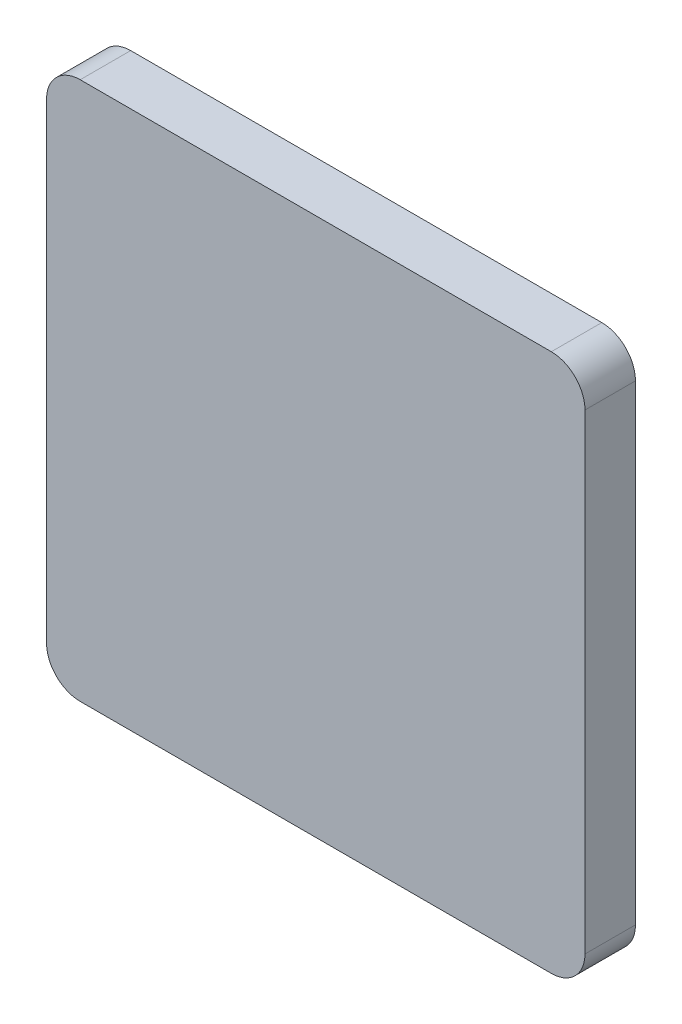
ISO-10303-21;
HEADER;
FILE_DESCRIPTION(('STEP AP214'),'2;1');
FILE_NAME('part.step','',(''),(''),'','','');
FILE_SCHEMA(('AUTOMOTIVE_DESIGN { 1 0 10303 214 1 1 1 1 }'));
ENDSEC;
DATA;
#1=APPLICATION_CONTEXT('core data for automotive mechanical design processes');
#2=APPLICATION_PROTOCOL_DEFINITION('international standard','automotive_design',2000,#1);
#3=PRODUCT_CONTEXT('',#1,'mechanical');
#4=PRODUCT('Part','Part','',(#3));
#5=PRODUCT_RELATED_PRODUCT_CATEGORY('part','',(#4));
#6=PRODUCT_DEFINITION_FORMATION('','',#4);
#7=PRODUCT_DEFINITION_CONTEXT('part definition',#1,'design');
#8=PRODUCT_DEFINITION('design','',#6,#7);
#9=PRODUCT_DEFINITION_SHAPE('','',#8);
#10=(LENGTH_UNIT() NAMED_UNIT(*) SI_UNIT(.MILLI.,.METRE.));
#11=(NAMED_UNIT(*) PLANE_ANGLE_UNIT() SI_UNIT($,.RADIAN.));
#12=(NAMED_UNIT(*) SI_UNIT($,.STERADIAN.) SOLID_ANGLE_UNIT());
#13=UNCERTAINTY_MEASURE_WITH_UNIT(LENGTH_MEASURE(1.E-05),#10,'distance_accuracy_value','');
#14=(GEOMETRIC_REPRESENTATION_CONTEXT(3) GLOBAL_UNCERTAINTY_ASSIGNED_CONTEXT((#13)) GLOBAL_UNIT_ASSIGNED_CONTEXT((#10,
#11,#12)) REPRESENTATION_CONTEXT('',''));
#15=CARTESIAN_POINT('',(0.,0.,0.));
#16=DIRECTION('',(0.,0.,1.));
#17=DIRECTION('',(1.,0.,0.));
#18=AXIS2_PLACEMENT_3D('',#15,#16,#17);
#19=CARTESIAN_POINT('',(16.,16.,3.));
#20=DIRECTION('',(-1.,0.,0.));
#21=DIRECTION('',(0.,0.,1.));
#22=AXIS2_PLACEMENT_3D('',#19,#20,#21);
#23=PLANE('',#22);
#24=DIRECTION('',(0.,1.,0.));
#25=VECTOR('',#24,1.);
#26=CARTESIAN_POINT('',(16.,16.,3.));
#27=LINE('',#26,#25);
#28=CARTESIAN_POINT('',(16.,-14.,3.));
#29=VERTEX_POINT('',#28);
#30=CARTESIAN_POINT('',(16.,14.,3.));
#31=VERTEX_POINT('',#30);
#32=EDGE_CURVE('E127',#29,#31,#27,.T.);
#33=ORIENTED_EDGE('',*,*,#32,.F.);
#34=DIRECTION('',(0.,0.,-1.));
#35=VECTOR('',#34,1.);
#36=CARTESIAN_POINT('',(16.,-14.,3.));
#37=LINE('',#36,#35);
#38=CARTESIAN_POINT('',(16.,-14.,0.));
#39=VERTEX_POINT('',#38);
#40=EDGE_CURVE('E112',#29,#39,#37,.T.);
#41=ORIENTED_EDGE('',*,*,#40,.T.);
#42=DIRECTION('',(0.,1.,0.));
#43=VECTOR('',#42,1.);
#44=CARTESIAN_POINT('',(16.,16.,0.));
#45=LINE('',#44,#43);
#46=CARTESIAN_POINT('',(16.,14.,0.));
#47=VERTEX_POINT('',#46);
#48=EDGE_CURVE('E124',#39,#47,#45,.T.);
#49=ORIENTED_EDGE('',*,*,#48,.T.);
#50=DIRECTION('',(0.,0.,-1.));
#51=VECTOR('',#50,1.);
#52=CARTESIAN_POINT('',(16.,14.,3.));
#53=LINE('',#52,#51);
#54=EDGE_CURVE('E129',#47,#31,#53,.F.);
#55=ORIENTED_EDGE('',*,*,#54,.T.);
#56=EDGE_LOOP('',(#33,#41,#49,#55));
#57=FACE_BOUND('',#56,.T.);
#58=ADVANCED_FACE('F41',(#57),#23,.F.);
#59=CARTESIAN_POINT('',(-16.,16.,3.));
#60=DIRECTION('',(0.,-1.,0.));
#61=DIRECTION('',(0.,0.,-1.));
#62=AXIS2_PLACEMENT_3D('',#59,#60,#61);
#63=PLANE('',#62);
#64=DIRECTION('',(-1.,0.,0.));
#65=VECTOR('',#64,1.);
#66=CARTESIAN_POINT('',(-16.,16.,3.));
#67=LINE('',#66,#65);
#68=CARTESIAN_POINT('',(14.,16.,3.));
#69=VERTEX_POINT('',#68);
#70=CARTESIAN_POINT('',(-14.,16.,3.));
#71=VERTEX_POINT('',#70);
#72=EDGE_CURVE('E167',#69,#71,#67,.T.);
#73=ORIENTED_EDGE('',*,*,#72,.F.);
#74=DIRECTION('',(0.,0.,-1.));
#75=VECTOR('',#74,1.);
#76=CARTESIAN_POINT('',(14.,16.,3.));
#77=LINE('',#76,#75);
#78=CARTESIAN_POINT('',(14.,16.,0.));
#79=VERTEX_POINT('',#78);
#80=EDGE_CURVE('E11',#69,#79,#77,.T.);
#81=ORIENTED_EDGE('',*,*,#80,.T.);
#82=DIRECTION('',(-1.,0.,0.));
#83=VECTOR('',#82,1.);
#84=CARTESIAN_POINT('',(-16.,16.,0.));
#85=LINE('',#84,#83);
#86=CARTESIAN_POINT('',(-14.,16.,0.));
#87=VERTEX_POINT('',#86);
#88=EDGE_CURVE('E134',#79,#87,#85,.T.);
#89=ORIENTED_EDGE('',*,*,#88,.T.);
#90=DIRECTION('',(0.,0.,-1.));
#91=VECTOR('',#90,1.);
#92=CARTESIAN_POINT('',(-14.,16.,3.));
#93=LINE('',#92,#91);
#94=EDGE_CURVE('E49',#87,#71,#93,.F.);
#95=ORIENTED_EDGE('',*,*,#94,.T.);
#96=EDGE_LOOP('',(#73,#81,#89,#95));
#97=FACE_BOUND('',#96,.T.);
#98=ADVANCED_FACE('F166',(#97),#63,.F.);
#99=CARTESIAN_POINT('',(-16.,16.,3.));
#100=DIRECTION('',(1.,0.,0.));
#101=DIRECTION('',(0.,0.,-1.));
#102=AXIS2_PLACEMENT_3D('',#99,#100,#101);
#103=PLANE('',#102);
#104=DIRECTION('',(0.,-1.,0.));
#105=VECTOR('',#104,1.);
#106=CARTESIAN_POINT('',(-16.,16.,0.));
#107=LINE('',#106,#105);
#108=CARTESIAN_POINT('',(-16.,14.,0.));
#109=VERTEX_POINT('',#108);
#110=CARTESIAN_POINT('',(-16.,-14.,0.));
#111=VERTEX_POINT('',#110);
#112=EDGE_CURVE('E137',#109,#111,#107,.T.);
#113=ORIENTED_EDGE('',*,*,#112,.T.);
#114=DIRECTION('',(0.,0.,-1.));
#115=VECTOR('',#114,1.);
#116=CARTESIAN_POINT('',(-16.,-14.,3.));
#117=LINE('',#116,#115);
#118=CARTESIAN_POINT('',(-16.,-14.,3.));
#119=VERTEX_POINT('',#118);
#120=EDGE_CURVE('E56',#111,#119,#117,.F.);
#121=ORIENTED_EDGE('',*,*,#120,.T.);
#122=DIRECTION('',(0.,-1.,0.));
#123=VECTOR('',#122,1.);
#124=CARTESIAN_POINT('',(-16.,16.,3.));
#125=LINE('',#124,#123);
#126=CARTESIAN_POINT('',(-16.,14.,3.));
#127=VERTEX_POINT('',#126);
#128=EDGE_CURVE('E173',#127,#119,#125,.T.);
#129=ORIENTED_EDGE('',*,*,#128,.F.);
#130=DIRECTION('',(0.,0.,-1.));
#131=VECTOR('',#130,1.);
#132=CARTESIAN_POINT('',(-16.,14.,3.));
#133=LINE('',#132,#131);
#134=EDGE_CURVE('E160',#127,#109,#133,.T.);
#135=ORIENTED_EDGE('',*,*,#134,.T.);
#136=EDGE_LOOP('',(#113,#121,#129,#135));
#137=FACE_BOUND('',#136,.T.);
#138=ADVANCED_FACE('F177',(#137),#103,.F.);
#139=CARTESIAN_POINT('',(-16.,-16.,3.));
#140=DIRECTION('',(0.,1.,0.));
#141=DIRECTION('',(0.,0.,1.));
#142=AXIS2_PLACEMENT_3D('',#139,#140,#141);
#143=PLANE('',#142);
#144=DIRECTION('',(1.,0.,0.));
#145=VECTOR('',#144,1.);
#146=CARTESIAN_POINT('',(-16.,-16.,0.));
#147=LINE('',#146,#145);
#148=CARTESIAN_POINT('',(-14.,-16.,0.));
#149=VERTEX_POINT('',#148);
#150=CARTESIAN_POINT('',(14.,-16.,0.));
#151=VERTEX_POINT('',#150);
#152=EDGE_CURVE('E144',#149,#151,#147,.T.);
#153=ORIENTED_EDGE('',*,*,#152,.T.);
#154=DIRECTION('',(0.,0.,-1.));
#155=VECTOR('',#154,1.);
#156=CARTESIAN_POINT('',(14.,-16.,3.));
#157=LINE('',#156,#155);
#158=CARTESIAN_POINT('',(14.,-16.,3.));
#159=VERTEX_POINT('',#158);
#160=EDGE_CURVE('E113',#151,#159,#157,.F.);
#161=ORIENTED_EDGE('',*,*,#160,.T.);
#162=DIRECTION('',(1.,0.,0.));
#163=VECTOR('',#162,1.);
#164=CARTESIAN_POINT('',(-16.,-16.,3.));
#165=LINE('',#164,#163);
#166=CARTESIAN_POINT('',(-14.,-16.,3.));
#167=VERTEX_POINT('',#166);
#168=EDGE_CURVE('E140',#167,#159,#165,.T.);
#169=ORIENTED_EDGE('',*,*,#168,.F.);
#170=DIRECTION('',(0.,0.,-1.));
#171=VECTOR('',#170,1.);
#172=CARTESIAN_POINT('',(-14.,-16.,3.));
#173=LINE('',#172,#171);
#174=EDGE_CURVE('E118',#167,#149,#173,.T.);
#175=ORIENTED_EDGE('',*,*,#174,.T.);
#176=EDGE_LOOP('',(#153,#161,#169,#175));
#177=FACE_BOUND('',#176,.T.);
#178=ADVANCED_FACE('F184',(#177),#143,.F.);
#179=CARTESIAN_POINT('',(0.,0.,3.));
#180=DIRECTION('',(0.,0.,1.));
#181=DIRECTION('',(1.,0.,0.));
#182=AXIS2_PLACEMENT_3D('',#179,#180,#181);
#183=PLANE('',#182);
#184=ORIENTED_EDGE('',*,*,#168,.T.);
#185=CARTESIAN_POINT('',(14.,-14.,3.));
#186=DIRECTION('',(0.,0.,1.));
#187=DIRECTION('',(1.,0.,0.));
#188=AXIS2_PLACEMENT_3D('',#185,#186,#187);
#189=CIRCLE('',#188,2.);
#190=EDGE_CURVE('E158',#159,#29,#189,.T.);
#191=ORIENTED_EDGE('',*,*,#190,.T.);
#192=ORIENTED_EDGE('',*,*,#32,.T.);
#193=CARTESIAN_POINT('',(14.,14.,3.));
#194=DIRECTION('',(0.,0.,1.));
#195=DIRECTION('',(1.,0.,0.));
#196=AXIS2_PLACEMENT_3D('',#193,#194,#195);
#197=CIRCLE('',#196,2.);
#198=EDGE_CURVE('E154',#31,#69,#197,.T.);
#199=ORIENTED_EDGE('',*,*,#198,.T.);
#200=ORIENTED_EDGE('',*,*,#72,.T.);
#201=CARTESIAN_POINT('',(-14.,14.,3.));
#202=DIRECTION('',(0.,0.,1.));
#203=DIRECTION('',(1.,0.,0.));
#204=AXIS2_PLACEMENT_3D('',#201,#202,#203);
#205=CIRCLE('',#204,2.);
#206=EDGE_CURVE('E63',#71,#127,#205,.T.);
#207=ORIENTED_EDGE('',*,*,#206,.T.);
#208=ORIENTED_EDGE('',*,*,#128,.T.);
#209=CARTESIAN_POINT('',(-14.,-14.,3.));
#210=DIRECTION('',(0.,0.,1.));
#211=DIRECTION('',(1.,0.,0.));
#212=AXIS2_PLACEMENT_3D('',#209,#210,#211);
#213=CIRCLE('',#212,2.);
#214=EDGE_CURVE('E156',#119,#167,#213,.T.);
#215=ORIENTED_EDGE('',*,*,#214,.T.);
#216=EDGE_LOOP('',(#184,#191,#192,#199,#200,#207,#208,#215));
#217=FACE_BOUND('',#216,.T.);
#218=ADVANCED_FACE('F171',(#217),#183,.T.);
#219=CARTESIAN_POINT('',(0.,0.,0.));
#220=DIRECTION('',(0.,0.,1.));
#221=DIRECTION('',(1.,0.,0.));
#222=AXIS2_PLACEMENT_3D('',#219,#220,#221);
#223=PLANE('',#222);
#224=ORIENTED_EDGE('',*,*,#48,.F.);
#225=CARTESIAN_POINT('',(14.,-14.,0.));
#226=DIRECTION('',(0.,0.,1.));
#227=DIRECTION('',(1.,0.,0.));
#228=AXIS2_PLACEMENT_3D('',#225,#226,#227);
#229=CIRCLE('',#228,2.);
#230=EDGE_CURVE('E108',#39,#151,#229,.F.);
#231=ORIENTED_EDGE('',*,*,#230,.T.);
#232=ORIENTED_EDGE('',*,*,#152,.F.);
#233=CARTESIAN_POINT('',(-14.,-14.,0.));
#234=DIRECTION('',(0.,0.,1.));
#235=DIRECTION('',(1.,0.,0.));
#236=AXIS2_PLACEMENT_3D('',#233,#234,#235);
#237=CIRCLE('',#236,2.);
#238=EDGE_CURVE('E119',#149,#111,#237,.F.);
#239=ORIENTED_EDGE('',*,*,#238,.T.);
#240=ORIENTED_EDGE('',*,*,#112,.F.);
#241=CARTESIAN_POINT('',(-14.,14.,0.));
#242=DIRECTION('',(0.,0.,1.));
#243=DIRECTION('',(1.,0.,0.));
#244=AXIS2_PLACEMENT_3D('',#241,#242,#243);
#245=CIRCLE('',#244,2.);
#246=EDGE_CURVE('E128',#109,#87,#245,.F.);
#247=ORIENTED_EDGE('',*,*,#246,.T.);
#248=ORIENTED_EDGE('',*,*,#88,.F.);
#249=CARTESIAN_POINT('',(14.,14.,0.));
#250=DIRECTION('',(0.,0.,1.));
#251=DIRECTION('',(1.,0.,0.));
#252=AXIS2_PLACEMENT_3D('',#249,#250,#251);
#253=CIRCLE('',#252,2.);
#254=EDGE_CURVE('E133',#79,#47,#253,.F.);
#255=ORIENTED_EDGE('',*,*,#254,.T.);
#256=EDGE_LOOP('',(#224,#231,#232,#239,#240,#247,#248,#255));
#257=FACE_BOUND('',#256,.T.);
#258=ADVANCED_FACE('F131',(#257),#223,.F.);
#259=CARTESIAN_POINT('',(14.,-14.,3.));
#260=DIRECTION('',(0.,0.,-1.));
#261=DIRECTION('',(-1.,0.,0.));
#262=AXIS2_PLACEMENT_3D('',#259,#260,#261);
#263=CYLINDRICAL_SURFACE('',#262,2.);
#264=ORIENTED_EDGE('',*,*,#190,.F.);
#265=ORIENTED_EDGE('',*,*,#160,.F.);
#266=ORIENTED_EDGE('',*,*,#230,.F.);
#267=ORIENTED_EDGE('',*,*,#40,.F.);
#268=EDGE_LOOP('',(#264,#265,#266,#267));
#269=FACE_BOUND('',#268,.T.);
#270=ADVANCED_FACE('F111',(#269),#263,.T.);
#271=CARTESIAN_POINT('',(-14.,-14.,3.));
#272=DIRECTION('',(0.,0.,-1.));
#273=DIRECTION('',(-1.,0.,0.));
#274=AXIS2_PLACEMENT_3D('',#271,#272,#273);
#275=CYLINDRICAL_SURFACE('',#274,2.);
#276=ORIENTED_EDGE('',*,*,#214,.F.);
#277=ORIENTED_EDGE('',*,*,#120,.F.);
#278=ORIENTED_EDGE('',*,*,#238,.F.);
#279=ORIENTED_EDGE('',*,*,#174,.F.);
#280=EDGE_LOOP('',(#276,#277,#278,#279));
#281=FACE_BOUND('',#280,.T.);
#282=ADVANCED_FACE('F181',(#281),#275,.T.);
#283=CARTESIAN_POINT('',(14.,14.,3.));
#284=DIRECTION('',(0.,0.,-1.));
#285=DIRECTION('',(-1.,0.,0.));
#286=AXIS2_PLACEMENT_3D('',#283,#284,#285);
#287=CYLINDRICAL_SURFACE('',#286,2.);
#288=ORIENTED_EDGE('',*,*,#198,.F.);
#289=ORIENTED_EDGE('',*,*,#54,.F.);
#290=ORIENTED_EDGE('',*,*,#254,.F.);
#291=ORIENTED_EDGE('',*,*,#80,.F.);
#292=EDGE_LOOP('',(#288,#289,#290,#291));
#293=FACE_BOUND('',#292,.T.);
#294=ADVANCED_FACE('F187',(#293),#287,.T.);
#295=CARTESIAN_POINT('',(-14.,14.,3.));
#296=DIRECTION('',(0.,0.,-1.));
#297=DIRECTION('',(-1.,0.,0.));
#298=AXIS2_PLACEMENT_3D('',#295,#296,#297);
#299=CYLINDRICAL_SURFACE('',#298,2.);
#300=ORIENTED_EDGE('',*,*,#206,.F.);
#301=ORIENTED_EDGE('',*,*,#94,.F.);
#302=ORIENTED_EDGE('',*,*,#246,.F.);
#303=ORIENTED_EDGE('',*,*,#134,.F.);
#304=EDGE_LOOP('',(#300,#301,#302,#303));
#305=FACE_BOUND('',#304,.T.);
#306=ADVANCED_FACE('F43',(#305),#299,.T.);
#307=CLOSED_SHELL('',(#58,#98,#138,#178,#218,#258,#270,#282,#294,#306));
#308=MANIFOLD_SOLID_BREP('B2',#307);
#309=ADVANCED_BREP_SHAPE_REPRESENTATION('',(#18,#308),#14);
#310=SHAPE_DEFINITION_REPRESENTATION(#9,#309);
ENDSEC;
END-ISO-10303-21;
